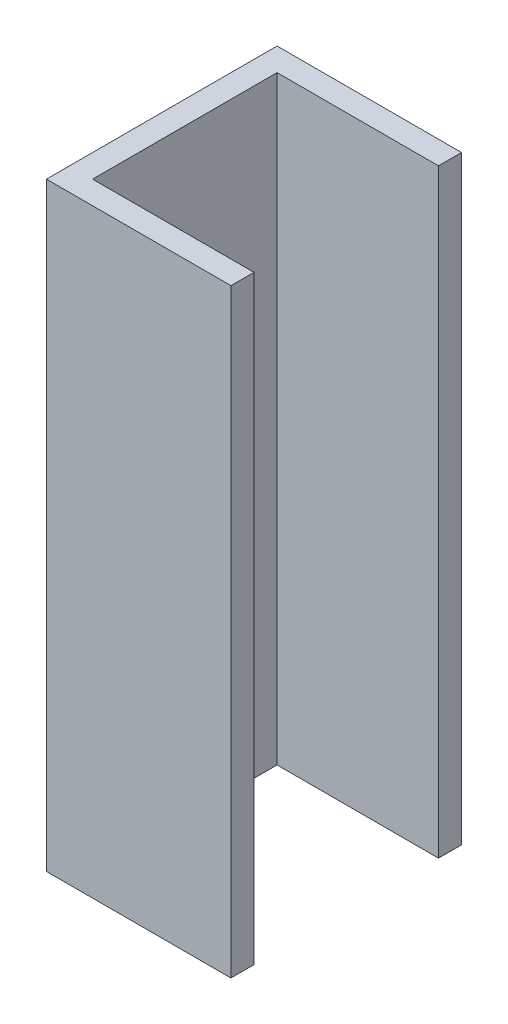
ISO-10303-21;
HEADER;
FILE_DESCRIPTION(('STEP AP214'),'2;1');
FILE_NAME('part.step','',(''),(''),'','','');
FILE_SCHEMA(('AUTOMOTIVE_DESIGN { 1 0 10303 214 1 1 1 1 }'));
ENDSEC;
DATA;
#1=APPLICATION_CONTEXT('core data for automotive mechanical design processes');
#2=APPLICATION_PROTOCOL_DEFINITION('international standard','automotive_design',2000,#1);
#3=PRODUCT_CONTEXT('',#1,'mechanical');
#4=PRODUCT('Part','Part','',(#3));
#5=PRODUCT_RELATED_PRODUCT_CATEGORY('part','',(#4));
#6=PRODUCT_DEFINITION_FORMATION('','',#4);
#7=PRODUCT_DEFINITION_CONTEXT('part definition',#1,'design');
#8=PRODUCT_DEFINITION('design','',#6,#7);
#9=PRODUCT_DEFINITION_SHAPE('','',#8);
#10=(LENGTH_UNIT() NAMED_UNIT(*) SI_UNIT(.MILLI.,.METRE.));
#11=(NAMED_UNIT(*) PLANE_ANGLE_UNIT() SI_UNIT($,.RADIAN.));
#12=(NAMED_UNIT(*) SI_UNIT($,.STERADIAN.) SOLID_ANGLE_UNIT());
#13=UNCERTAINTY_MEASURE_WITH_UNIT(LENGTH_MEASURE(1.E-05),#10,'distance_accuracy_value','');
#14=(GEOMETRIC_REPRESENTATION_CONTEXT(3) GLOBAL_UNCERTAINTY_ASSIGNED_CONTEXT((#13)) GLOBAL_UNIT_ASSIGNED_CONTEXT((#10,
#11,#12)) REPRESENTATION_CONTEXT('',''));
#15=CARTESIAN_POINT('',(0.,0.,0.));
#16=DIRECTION('',(0.,0.,1.));
#17=DIRECTION('',(1.,0.,0.));
#18=AXIS2_PLACEMENT_3D('',#15,#16,#17);
#19=CARTESIAN_POINT('',(0.05,0.,0.05));
#20=DIRECTION('',(1.,0.,0.));
#21=DIRECTION('',(0.,0.,-1.));
#22=AXIS2_PLACEMENT_3D('',#19,#20,#21);
#23=PLANE('',#22);
#24=DIRECTION('',(0.,0.,-1.));
#25=VECTOR('',#24,1.);
#26=CARTESIAN_POINT('',(0.05,1.3,0.05));
#27=LINE('',#26,#25);
#28=CARTESIAN_POINT('',(0.05,1.3,0.05));
#29=VERTEX_POINT('',#28);
#30=CARTESIAN_POINT('',(0.05,1.3,0.45));
#31=VERTEX_POINT('',#30);
#32=EDGE_CURVE('E91',#29,#31,#27,.F.);
#33=ORIENTED_EDGE('',*,*,#32,.T.);
#34=DIRECTION('',(0.,1.,0.));
#35=VECTOR('',#34,1.);
#36=CARTESIAN_POINT('',(0.05,0.,0.45));
#37=LINE('',#36,#35);
#38=CARTESIAN_POINT('',(0.05,0.,0.45));
#39=VERTEX_POINT('',#38);
#40=EDGE_CURVE('E103',#31,#39,#37,.F.);
#41=ORIENTED_EDGE('',*,*,#40,.T.);
#42=DIRECTION('',(0.,0.,-1.));
#43=VECTOR('',#42,1.);
#44=CARTESIAN_POINT('',(0.05,0.,0.05));
#45=LINE('',#44,#43);
#46=CARTESIAN_POINT('',(0.05,0.,0.05));
#47=VERTEX_POINT('',#46);
#48=EDGE_CURVE('E20',#39,#47,#45,.T.);
#49=ORIENTED_EDGE('',*,*,#48,.T.);
#50=DIRECTION('',(0.,1.,0.));
#51=VECTOR('',#50,1.);
#52=CARTESIAN_POINT('',(0.05,0.,0.05));
#53=LINE('',#52,#51);
#54=EDGE_CURVE('E86',#29,#47,#53,.F.);
#55=ORIENTED_EDGE('',*,*,#54,.F.);
#56=EDGE_LOOP('',(#33,#41,#49,#55));
#57=FACE_BOUND('',#56,.T.);
#58=ADVANCED_FACE('F17',(#57),#23,.T.);
#59=CARTESIAN_POINT('',(0.05,0.,0.05));
#60=DIRECTION('',(0.,0.,1.));
#61=DIRECTION('',(1.,0.,0.));
#62=AXIS2_PLACEMENT_3D('',#59,#60,#61);
#63=PLANE('',#62);
#64=DIRECTION('',(1.,0.,0.));
#65=VECTOR('',#64,1.);
#66=CARTESIAN_POINT('',(0.05,0.,0.05));
#67=LINE('',#66,#65);
#68=CARTESIAN_POINT('',(0.4,0.,0.05));
#69=VERTEX_POINT('',#68);
#70=EDGE_CURVE('E98',#47,#69,#67,.T.);
#71=ORIENTED_EDGE('',*,*,#70,.T.);
#72=DIRECTION('',(0.,1.,0.));
#73=VECTOR('',#72,1.);
#74=CARTESIAN_POINT('',(0.4,0.,0.05));
#75=LINE('',#74,#73);
#76=CARTESIAN_POINT('',(0.4,1.3,0.05));
#77=VERTEX_POINT('',#76);
#78=EDGE_CURVE('E89',#77,#69,#75,.F.);
#79=ORIENTED_EDGE('',*,*,#78,.F.);
#80=DIRECTION('',(1.,0.,0.));
#81=VECTOR('',#80,1.);
#82=CARTESIAN_POINT('',(0.05,1.3,0.05));
#83=LINE('',#82,#81);
#84=EDGE_CURVE('E83',#77,#29,#83,.F.);
#85=ORIENTED_EDGE('',*,*,#84,.T.);
#86=ORIENTED_EDGE('',*,*,#54,.T.);
#87=EDGE_LOOP('',(#71,#79,#85,#86));
#88=FACE_BOUND('',#87,.T.);
#89=ADVANCED_FACE('F85',(#88),#63,.T.);
#90=CARTESIAN_POINT('',(0.05,0.,0.45));
#91=DIRECTION('',(0.,0.,1.));
#92=DIRECTION('',(1.,0.,0.));
#93=AXIS2_PLACEMENT_3D('',#90,#91,#92);
#94=PLANE('',#93);
#95=DIRECTION('',(1.,0.,0.));
#96=VECTOR('',#95,1.);
#97=CARTESIAN_POINT('',(0.05,0.,0.45));
#98=LINE('',#97,#96);
#99=CARTESIAN_POINT('',(0.4,0.,0.45));
#100=VERTEX_POINT('',#99);
#101=EDGE_CURVE('E105',#39,#100,#98,.T.);
#102=ORIENTED_EDGE('',*,*,#101,.F.);
#103=ORIENTED_EDGE('',*,*,#40,.F.);
#104=DIRECTION('',(1.,0.,0.));
#105=VECTOR('',#104,1.);
#106=CARTESIAN_POINT('',(0.05,1.3,0.45));
#107=LINE('',#106,#105);
#108=CARTESIAN_POINT('',(0.4,1.3,0.45));
#109=VERTEX_POINT('',#108);
#110=EDGE_CURVE('E96',#109,#31,#107,.F.);
#111=ORIENTED_EDGE('',*,*,#110,.F.);
#112=DIRECTION('',(0.,1.,0.));
#113=VECTOR('',#112,1.);
#114=CARTESIAN_POINT('',(0.4,0.,0.45));
#115=LINE('',#114,#113);
#116=EDGE_CURVE('E110',#100,#109,#115,.T.);
#117=ORIENTED_EDGE('',*,*,#116,.F.);
#118=EDGE_LOOP('',(#102,#103,#111,#117));
#119=FACE_BOUND('',#118,.T.);
#120=ADVANCED_FACE('F177',(#119),#94,.F.);
#121=CARTESIAN_POINT('',(0.4,0.,0.));
#122=DIRECTION('',(1.,0.,0.));
#123=DIRECTION('',(0.,0.,-1.));
#124=AXIS2_PLACEMENT_3D('',#121,#122,#123);
#125=PLANE('',#124);
#126=DIRECTION('',(0.,0.,-1.));
#127=VECTOR('',#126,1.);
#128=CARTESIAN_POINT('',(0.4,1.3,0.));
#129=LINE('',#128,#127);
#130=CARTESIAN_POINT('',(0.4,1.3,0.));
#131=VERTEX_POINT('',#130);
#132=EDGE_CURVE('E107',#131,#77,#129,.F.);
#133=ORIENTED_EDGE('',*,*,#132,.T.);
#134=ORIENTED_EDGE('',*,*,#78,.T.);
#135=DIRECTION('',(0.,0.,1.));
#136=VECTOR('',#135,1.);
#137=CARTESIAN_POINT('',(0.4,0.,0.));
#138=LINE('',#137,#136);
#139=CARTESIAN_POINT('',(0.4,0.,0.));
#140=VERTEX_POINT('',#139);
#141=EDGE_CURVE('E113',#69,#140,#138,.F.);
#142=ORIENTED_EDGE('',*,*,#141,.T.);
#143=DIRECTION('',(0.,1.,0.));
#144=VECTOR('',#143,1.);
#145=CARTESIAN_POINT('',(0.4,0.,0.));
#146=LINE('',#145,#144);
#147=EDGE_CURVE('E121',#140,#131,#146,.T.);
#148=ORIENTED_EDGE('',*,*,#147,.T.);
#149=EDGE_LOOP('',(#133,#134,#142,#148));
#150=FACE_BOUND('',#149,.T.);
#151=ADVANCED_FACE('F173',(#150),#125,.T.);
#152=CARTESIAN_POINT('',(0.4,0.,0.));
#153=DIRECTION('',(1.,0.,0.));
#154=DIRECTION('',(0.,0.,-1.));
#155=AXIS2_PLACEMENT_3D('',#152,#153,#154);
#156=PLANE('',#155);
#157=DIRECTION('',(0.,0.,1.));
#158=VECTOR('',#157,1.);
#159=CARTESIAN_POINT('',(0.4,1.3,0.));
#160=LINE('',#159,#158);
#161=CARTESIAN_POINT('',(0.4,1.3,0.5));
#162=VERTEX_POINT('',#161);
#163=EDGE_CURVE('E126',#162,#109,#160,.F.);
#164=ORIENTED_EDGE('',*,*,#163,.F.);
#165=DIRECTION('',(0.,1.,0.));
#166=VECTOR('',#165,1.);
#167=CARTESIAN_POINT('',(0.4,0.,0.5));
#168=LINE('',#167,#166);
#169=CARTESIAN_POINT('',(0.4,0.,0.5));
#170=VERTEX_POINT('',#169);
#171=EDGE_CURVE('E131',#170,#162,#168,.T.);
#172=ORIENTED_EDGE('',*,*,#171,.F.);
#173=DIRECTION('',(0.,0.,1.));
#174=VECTOR('',#173,1.);
#175=CARTESIAN_POINT('',(0.4,0.,0.));
#176=LINE('',#175,#174);
#177=EDGE_CURVE('E115',#170,#100,#176,.F.);
#178=ORIENTED_EDGE('',*,*,#177,.T.);
#179=ORIENTED_EDGE('',*,*,#116,.T.);
#180=EDGE_LOOP('',(#164,#172,#178,#179));
#181=FACE_BOUND('',#180,.T.);
#182=ADVANCED_FACE('F170',(#181),#156,.T.);
#183=CARTESIAN_POINT('',(0.,0.,0.));
#184=DIRECTION('',(0.,1.,0.));
#185=DIRECTION('',(0.,0.,1.));
#186=AXIS2_PLACEMENT_3D('',#183,#184,#185);
#187=PLANE('',#186);
#188=ORIENTED_EDGE('',*,*,#48,.F.);
#189=ORIENTED_EDGE('',*,*,#101,.T.);
#190=ORIENTED_EDGE('',*,*,#177,.F.);
#191=DIRECTION('',(1.,0.,0.));
#192=VECTOR('',#191,1.);
#193=CARTESIAN_POINT('',(0.,0.,0.5));
#194=LINE('',#193,#192);
#195=CARTESIAN_POINT('',(0.,0.,0.5));
#196=VERTEX_POINT('',#195);
#197=EDGE_CURVE('E128',#196,#170,#194,.T.);
#198=ORIENTED_EDGE('',*,*,#197,.F.);
#199=DIRECTION('',(0.,0.,-1.));
#200=VECTOR('',#199,1.);
#201=CARTESIAN_POINT('',(0.,0.,0.));
#202=LINE('',#201,#200);
#203=CARTESIAN_POINT('',(0.,0.,0.));
#204=VERTEX_POINT('',#203);
#205=EDGE_CURVE('E134',#196,#204,#202,.T.);
#206=ORIENTED_EDGE('',*,*,#205,.T.);
#207=DIRECTION('',(1.,0.,0.));
#208=VECTOR('',#207,1.);
#209=CARTESIAN_POINT('',(0.,0.,0.));
#210=LINE('',#209,#208);
#211=EDGE_CURVE('E118',#204,#140,#210,.T.);
#212=ORIENTED_EDGE('',*,*,#211,.T.);
#213=ORIENTED_EDGE('',*,*,#141,.F.);
#214=ORIENTED_EDGE('',*,*,#70,.F.);
#215=EDGE_LOOP('',(#188,#189,#190,#198,#206,#212,#213,#214));
#216=FACE_BOUND('',#215,.T.);
#217=ADVANCED_FACE('F151',(#216),#187,.F.);
#218=CARTESIAN_POINT('',(0.,0.,0.));
#219=DIRECTION('',(0.,0.,1.));
#220=DIRECTION('',(1.,0.,0.));
#221=AXIS2_PLACEMENT_3D('',#218,#219,#220);
#222=PLANE('',#221);
#223=ORIENTED_EDGE('',*,*,#147,.F.);
#224=ORIENTED_EDGE('',*,*,#211,.F.);
#225=DIRECTION('',(0.,1.,0.));
#226=VECTOR('',#225,1.);
#227=CARTESIAN_POINT('',(0.,0.,0.));
#228=LINE('',#227,#226);
#229=CARTESIAN_POINT('',(0.,1.3,0.));
#230=VERTEX_POINT('',#229);
#231=EDGE_CURVE('E137',#204,#230,#228,.T.);
#232=ORIENTED_EDGE('',*,*,#231,.T.);
#233=DIRECTION('',(1.,0.,0.));
#234=VECTOR('',#233,1.);
#235=CARTESIAN_POINT('',(0.,1.3,0.));
#236=LINE('',#235,#234);
#237=EDGE_CURVE('E124',#131,#230,#236,.F.);
#238=ORIENTED_EDGE('',*,*,#237,.F.);
#239=EDGE_LOOP('',(#223,#224,#232,#238));
#240=FACE_BOUND('',#239,.T.);
#241=ADVANCED_FACE('F148',(#240),#222,.F.);
#242=CARTESIAN_POINT('',(0.,1.3,0.));
#243=DIRECTION('',(0.,1.,0.));
#244=DIRECTION('',(0.,0.,1.));
#245=AXIS2_PLACEMENT_3D('',#242,#243,#244);
#246=PLANE('',#245);
#247=ORIENTED_EDGE('',*,*,#32,.F.);
#248=ORIENTED_EDGE('',*,*,#84,.F.);
#249=ORIENTED_EDGE('',*,*,#132,.F.);
#250=ORIENTED_EDGE('',*,*,#237,.T.);
#251=DIRECTION('',(0.,0.,-1.));
#252=VECTOR('',#251,1.);
#253=CARTESIAN_POINT('',(0.,1.3,0.));
#254=LINE('',#253,#252);
#255=CARTESIAN_POINT('',(0.,1.3,0.5));
#256=VERTEX_POINT('',#255);
#257=EDGE_CURVE('E26',#230,#256,#254,.F.);
#258=ORIENTED_EDGE('',*,*,#257,.T.);
#259=DIRECTION('',(1.,0.,0.));
#260=VECTOR('',#259,1.);
#261=CARTESIAN_POINT('',(0.,1.3,0.5));
#262=LINE('',#261,#260);
#263=EDGE_CURVE('E34',#162,#256,#262,.F.);
#264=ORIENTED_EDGE('',*,*,#263,.F.);
#265=ORIENTED_EDGE('',*,*,#163,.T.);
#266=ORIENTED_EDGE('',*,*,#110,.T.);
#267=EDGE_LOOP('',(#247,#248,#249,#250,#258,#264,#265,#266));
#268=FACE_BOUND('',#267,.T.);
#269=ADVANCED_FACE('F94',(#268),#246,.T.);
#270=CARTESIAN_POINT('',(0.,0.,0.5));
#271=DIRECTION('',(0.,0.,1.));
#272=DIRECTION('',(1.,0.,0.));
#273=AXIS2_PLACEMENT_3D('',#270,#271,#272);
#274=PLANE('',#273);
#275=ORIENTED_EDGE('',*,*,#171,.T.);
#276=ORIENTED_EDGE('',*,*,#263,.T.);
#277=DIRECTION('',(0.,1.,0.));
#278=VECTOR('',#277,1.);
#279=CARTESIAN_POINT('',(0.,0.,0.5));
#280=LINE('',#279,#278);
#281=EDGE_CURVE('E11',#256,#196,#280,.F.);
#282=ORIENTED_EDGE('',*,*,#281,.T.);
#283=ORIENTED_EDGE('',*,*,#197,.T.);
#284=EDGE_LOOP('',(#275,#276,#282,#283));
#285=FACE_BOUND('',#284,.T.);
#286=ADVANCED_FACE('F154',(#285),#274,.T.);
#287=CARTESIAN_POINT('',(0.,0.,0.));
#288=DIRECTION('',(1.,0.,0.));
#289=DIRECTION('',(0.,0.,-1.));
#290=AXIS2_PLACEMENT_3D('',#287,#288,#289);
#291=PLANE('',#290);
#292=ORIENTED_EDGE('',*,*,#257,.F.);
#293=ORIENTED_EDGE('',*,*,#231,.F.);
#294=ORIENTED_EDGE('',*,*,#205,.F.);
#295=ORIENTED_EDGE('',*,*,#281,.F.);
#296=EDGE_LOOP('',(#292,#293,#294,#295));
#297=FACE_BOUND('',#296,.T.);
#298=ADVANCED_FACE('F145',(#297),#291,.F.);
#299=CLOSED_SHELL('',(#58,#89,#120,#151,#182,#217,#241,#269,#286,#298));
#300=MANIFOLD_SOLID_BREP('B1',#299);
#301=ADVANCED_BREP_SHAPE_REPRESENTATION('',(#18,#300),#14);
#302=SHAPE_DEFINITION_REPRESENTATION(#9,#301);
ENDSEC;
END-ISO-10303-21;
